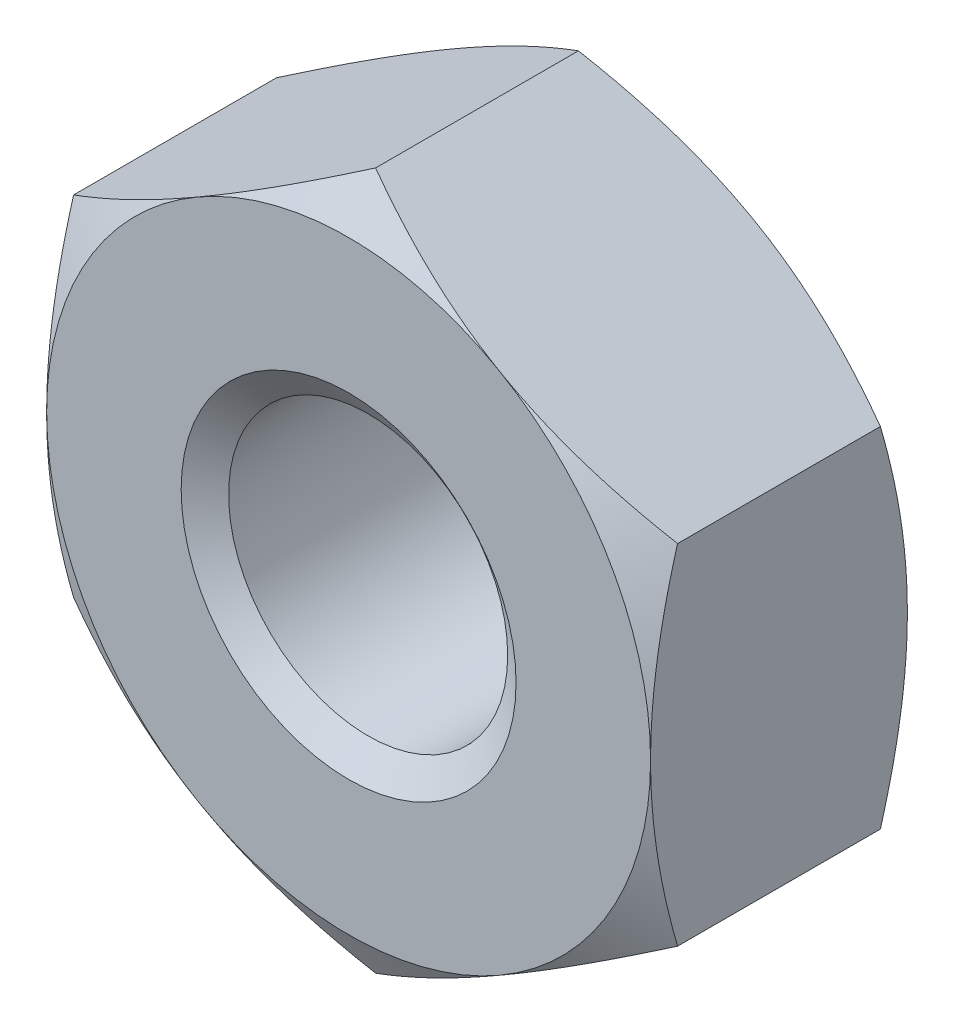
ISO-10303-21;
HEADER;
FILE_DESCRIPTION(('STEP AP214'),'2;1');
FILE_NAME('part.step','',(''),(''),'','','');
FILE_SCHEMA(('AUTOMOTIVE_DESIGN { 1 0 10303 214 1 1 1 1 }'));
ENDSEC;
DATA;
#1=APPLICATION_CONTEXT('core data for automotive mechanical design processes');
#2=APPLICATION_PROTOCOL_DEFINITION('international standard','automotive_design',2000,#1);
#3=PRODUCT_CONTEXT('',#1,'mechanical');
#4=PRODUCT('Part','Part','',(#3));
#5=PRODUCT_RELATED_PRODUCT_CATEGORY('part','',(#4));
#6=PRODUCT_DEFINITION_FORMATION('','',#4);
#7=PRODUCT_DEFINITION_CONTEXT('part definition',#1,'design');
#8=PRODUCT_DEFINITION('design','',#6,#7);
#9=PRODUCT_DEFINITION_SHAPE('','',#8);
#10=(LENGTH_UNIT() NAMED_UNIT(*) SI_UNIT(.MILLI.,.METRE.));
#11=(NAMED_UNIT(*) PLANE_ANGLE_UNIT() SI_UNIT($,.RADIAN.));
#12=(NAMED_UNIT(*) SI_UNIT($,.STERADIAN.) SOLID_ANGLE_UNIT());
#13=UNCERTAINTY_MEASURE_WITH_UNIT(LENGTH_MEASURE(1.E-05),#10,'distance_accuracy_value','');
#14=(GEOMETRIC_REPRESENTATION_CONTEXT(3) GLOBAL_UNCERTAINTY_ASSIGNED_CONTEXT((#13)) GLOBAL_UNIT_ASSIGNED_CONTEXT((#10,
#11,#12)) REPRESENTATION_CONTEXT('',''));
#15=CARTESIAN_POINT('',(0.,0.,0.));
#16=DIRECTION('',(0.,0.,1.));
#17=DIRECTION('',(1.,0.,0.));
#18=AXIS2_PLACEMENT_3D('',#15,#16,#17);
#19=CARTESIAN_POINT('',(0.,0.,-2.3));
#20=DIRECTION('',(0.,0.,1.));
#21=DIRECTION('',(1.,0.,0.));
#22=AXIS2_PLACEMENT_3D('',#19,#20,#21);
#23=CYLINDRICAL_SURFACE('',#22,1.25);
#24=CARTESIAN_POINT('',(0.,0.,-0.175051884552426));
#25=DIRECTION('',(0.,0.,1.));
#26=DIRECTION('',(1.,0.,0.));
#27=AXIS2_PLACEMENT_3D('',#24,#25,#26);
#28=CIRCLE('',#27,1.25);
#29=CARTESIAN_POINT('',(1.25,0.,-0.175051884552426));
#30=VERTEX_POINT('',#29);
#31=EDGE_CURVE('E175',#30,#30,#28,.F.);
#32=ORIENTED_EDGE('',*,*,#31,.F.);
#33=EDGE_LOOP('',(#32));
#34=FACE_BOUND('',#33,.T.);
#35=CARTESIAN_POINT('',(0.,0.,-2.09954811544757));
#36=DIRECTION('',(0.,0.,-1.));
#37=DIRECTION('',(-1.,0.,0.));
#38=AXIS2_PLACEMENT_3D('',#35,#36,#37);
#39=CIRCLE('',#38,1.25);
#40=CARTESIAN_POINT('',(-1.25,0.,-2.09954811544757));
#41=VERTEX_POINT('',#40);
#42=EDGE_CURVE('E39',#41,#41,#39,.F.);
#43=ORIENTED_EDGE('',*,*,#42,.F.);
#44=EDGE_LOOP('',(#43));
#45=FACE_BOUND('',#44,.T.);
#46=ADVANCED_FACE('F34',(#34,#45),#23,.F.);
#47=CARTESIAN_POINT('',(-5.40999999999999,0.,-2.3));
#48=DIRECTION('',(0.,0.,1.));
#49=DIRECTION('',(1.,0.,0.));
#50=AXIS2_PLACEMENT_3D('',#47,#48,#49);
#51=PLANE('',#50);
#52=CARTESIAN_POINT('',(0.,0.,-2.3));
#53=DIRECTION('',(0.,0.,1.));
#54=DIRECTION('',(1.,0.,0.));
#55=AXIS2_PLACEMENT_3D('',#52,#53,#54);
#56=CIRCLE('',#55,2.705);
#57=CARTESIAN_POINT('',(2.705,0.,-2.3));
#58=VERTEX_POINT('',#57);
#59=CARTESIAN_POINT('',(1.3525,2.34259871723691,-2.3));
#60=VERTEX_POINT('',#59);
#61=EDGE_CURVE('E245',#58,#60,#56,.T.);
#62=ORIENTED_EDGE('',*,*,#61,.F.);
#63=CARTESIAN_POINT('',(0.,0.,-2.3));
#64=DIRECTION('',(0.,0.,1.));
#65=DIRECTION('',(1.,0.,0.));
#66=AXIS2_PLACEMENT_3D('',#63,#64,#65);
#67=CIRCLE('',#66,2.705);
#68=CARTESIAN_POINT('',(1.3525,-2.34259871723691,-2.3));
#69=VERTEX_POINT('',#68);
#70=EDGE_CURVE('E169',#58,#69,#67,.F.);
#71=ORIENTED_EDGE('',*,*,#70,.T.);
#72=CARTESIAN_POINT('',(-1.3525,-2.34259871723691,-2.3));
#73=VERTEX_POINT('',#72);
#74=EDGE_CURVE('E171',#69,#73,#67,.F.);
#75=ORIENTED_EDGE('',*,*,#74,.T.);
#76=CARTESIAN_POINT('',(-2.705,0.,-2.3));
#77=VERTEX_POINT('',#76);
#78=EDGE_CURVE('E402',#73,#77,#67,.F.);
#79=ORIENTED_EDGE('',*,*,#78,.T.);
#80=CARTESIAN_POINT('',(-1.3525,2.34259871723691,-2.3));
#81=VERTEX_POINT('',#80);
#82=EDGE_CURVE('E404',#77,#81,#67,.F.);
#83=ORIENTED_EDGE('',*,*,#82,.T.);
#84=EDGE_CURVE('E153',#81,#60,#67,.F.);
#85=ORIENTED_EDGE('',*,*,#84,.T.);
#86=EDGE_LOOP('',(#62,#71,#75,#79,#83,#85));
#87=FACE_BOUND('',#86,.T.);
#88=CARTESIAN_POINT('',(0.,0.,-2.3));
#89=DIRECTION('',(0.,0.,1.));
#90=DIRECTION('',(1.,0.,0.));
#91=AXIS2_PLACEMENT_3D('',#88,#89,#90);
#92=CIRCLE('',#91,1.5);
#93=CARTESIAN_POINT('',(1.5,0.,-2.3));
#94=VERTEX_POINT('',#93);
#95=EDGE_CURVE('E178',#94,#94,#92,.F.);
#96=ORIENTED_EDGE('',*,*,#95,.F.);
#97=EDGE_LOOP('',(#96));
#98=FACE_BOUND('',#97,.T.);
#99=ADVANCED_FACE('F297',(#87,#98),#51,.F.);
#100=CARTESIAN_POINT('',(-5.40999999999999,0.,0.));
#101=DIRECTION('',(0.,0.,1.));
#102=DIRECTION('',(1.,0.,0.));
#103=AXIS2_PLACEMENT_3D('',#100,#101,#102);
#104=PLANE('',#103);
#105=CARTESIAN_POINT('',(0.,0.,0.));
#106=DIRECTION('',(0.,0.,1.));
#107=DIRECTION('',(1.,0.,0.));
#108=AXIS2_PLACEMENT_3D('',#105,#106,#107);
#109=CIRCLE('',#108,2.705);
#110=CARTESIAN_POINT('',(1.3525,-2.34259871723691,0.));
#111=VERTEX_POINT('',#110);
#112=CARTESIAN_POINT('',(2.705,0.,0.));
#113=VERTEX_POINT('',#112);
#114=EDGE_CURVE('E46',#111,#113,#109,.T.);
#115=ORIENTED_EDGE('',*,*,#114,.T.);
#116=CARTESIAN_POINT('',(0.,0.,0.));
#117=DIRECTION('',(0.,0.,1.));
#118=DIRECTION('',(1.,0.,0.));
#119=AXIS2_PLACEMENT_3D('',#116,#117,#118);
#120=CIRCLE('',#119,2.705);
#121=CARTESIAN_POINT('',(1.3525,2.34259871723691,0.));
#122=VERTEX_POINT('',#121);
#123=EDGE_CURVE('E53',#113,#122,#120,.T.);
#124=ORIENTED_EDGE('',*,*,#123,.T.);
#125=CARTESIAN_POINT('',(-1.3525,2.34259871723691,0.));
#126=VERTEX_POINT('',#125);
#127=EDGE_CURVE('E11',#122,#126,#109,.T.);
#128=ORIENTED_EDGE('',*,*,#127,.T.);
#129=CARTESIAN_POINT('',(-2.705,0.,0.));
#130=VERTEX_POINT('',#129);
#131=EDGE_CURVE('E44',#126,#130,#109,.T.);
#132=ORIENTED_EDGE('',*,*,#131,.T.);
#133=CARTESIAN_POINT('',(-1.3525,-2.34259871723691,0.));
#134=VERTEX_POINT('',#133);
#135=EDGE_CURVE('E348',#130,#134,#109,.T.);
#136=ORIENTED_EDGE('',*,*,#135,.T.);
#137=EDGE_CURVE('E174',#134,#111,#109,.T.);
#138=ORIENTED_EDGE('',*,*,#137,.T.);
#139=EDGE_LOOP('',(#115,#124,#128,#132,#136,#138));
#140=FACE_BOUND('',#139,.T.);
#141=CARTESIAN_POINT('',(0.,0.,0.));
#142=DIRECTION('',(0.,0.,1.));
#143=DIRECTION('',(1.,0.,0.));
#144=AXIS2_PLACEMENT_3D('',#141,#142,#143);
#145=CIRCLE('',#144,1.5);
#146=CARTESIAN_POINT('',(1.5,0.,0.));
#147=VERTEX_POINT('',#146);
#148=EDGE_CURVE('E177',#147,#147,#145,.T.);
#149=ORIENTED_EDGE('',*,*,#148,.F.);
#150=EDGE_LOOP('',(#149));
#151=FACE_BOUND('',#150,.T.);
#152=ADVANCED_FACE('F250',(#140,#151),#104,.T.);
#153=CARTESIAN_POINT('',(0.,3.12346495631588,-2.3));
#154=DIRECTION('',(-0.500000000000001,0.866025403784438,0.));
#155=DIRECTION('',(-0.866025403784438,-0.500000000000001,0.));
#156=AXIS2_PLACEMENT_3D('',#153,#154,#155);
#157=PLANE('',#156);
#158=DIRECTION('',(0.,0.,1.));
#159=VECTOR('',#158,1.);
#160=CARTESIAN_POINT('',(-2.705,1.56173247815794,-2.3));
#161=LINE('',#160,#159);
#162=CARTESIAN_POINT('',(-2.705,1.56173247815794,-2.0583991448246));
#163=VERTEX_POINT('',#162);
#164=CARTESIAN_POINT('',(-2.705,1.56173247815794,-0.241600855175396));
#165=VERTEX_POINT('',#164);
#166=EDGE_CURVE('E165',#163,#165,#161,.T.);
#167=ORIENTED_EDGE('',*,*,#166,.T.);
#168=CARTESIAN_POINT('',(-2.7052,1.5616170081041,-0.241667525538783));
#169=CARTESIAN_POINT('',(-2.58632825680688,1.63024764103569,-0.202027774658742));
#170=CARTESIAN_POINT('',(-2.4664304218686,1.69947068831256,-0.165976659538689));
#171=CARTESIAN_POINT('',(-2.22455852606025,1.83911549246691,-0.103048601430435));
#172=CARTESIAN_POINT('',(-2.10258016695556,1.90953973093131,-0.0761939208944315));
#173=CARTESIAN_POINT('',(-1.8601351667638,2.0495154170557,-0.0343900483953198));
#174=CARTESIAN_POINT('',(-1.73970583224199,2.1190453257602,-0.0191626405786178));
#175=CARTESIAN_POINT('',(-1.49828040231533,2.25843236271758,-0.000983153261820243));
#176=CARTESIAN_POINT('',(-1.37728518462876,2.32828898421958,0.00198397922888698));
#177=CARTESIAN_POINT('',(-1.15119223938198,2.45882380701968,-0.00418341604988198));
#178=CARTESIAN_POINT('',(-1.04606069401314,2.5195215330387,-0.0118036374939056));
#179=CARTESIAN_POINT('',(-0.836482545838846,2.64052153330339,-0.0359569039149928));
#180=CARTESIAN_POINT('',(-0.732036668110246,2.70082338892575,-0.052498202432647));
#181=CARTESIAN_POINT('',(-0.522026288785161,2.8220729379617,-0.0938508132152027));
#182=CARTESIAN_POINT('',(-0.416488372042922,2.88300528260255,-0.118837445864966));
#183=CARTESIAN_POINT('',(-0.206986757533964,3.00396109613495,-0.175547523369917));
#184=CARTESIAN_POINT('',(-0.103020375018959,3.06398611506666,-0.207257640313646));
#185=CARTESIAN_POINT('',(0.000200000000000147,3.12358042636972,-0.241667525538785));
#186=B_SPLINE_CURVE_WITH_KNOTS('',3,(#168,#169,#170,#171,#172,#173,#174,#175,#176,#177,#178,
#179,#180,#181,#182,#183,#184,#185),.UNSPECIFIED.,.F.,.F.,(4,2,2,2,2,2,2,2,4),(0.,
0.428779968479325,0.858590696260524,1.27776339794879,1.69642129218898,2.06097746545958,
2.42587149633085,2.7988602815117,3.17111649317388),.UNSPECIFIED.);
#187=EDGE_CURVE('E61',#165,#126,#186,.T.);
#188=ORIENTED_EDGE('',*,*,#187,.T.);
#189=CARTESIAN_POINT('',(0.,3.12346495631588,-0.241600855175397));
#190=VERTEX_POINT('',#189);
#191=EDGE_CURVE('E239',#126,#190,#186,.T.);
#192=ORIENTED_EDGE('',*,*,#191,.T.);
#193=DIRECTION('',(0.,0.,1.));
#194=VECTOR('',#193,1.);
#195=CARTESIAN_POINT('',(0.,3.12346495631588,-2.3));
#196=LINE('',#195,#194);
#197=CARTESIAN_POINT('',(0.,3.12346495631588,-2.0583991448246));
#198=VERTEX_POINT('',#197);
#199=EDGE_CURVE('E150',#198,#190,#196,.T.);
#200=ORIENTED_EDGE('',*,*,#199,.F.);
#201=CARTESIAN_POINT('',(-2.7052,1.5616170081041,-2.05833247446122));
#202=CARTESIAN_POINT('',(-2.58632825680688,1.63024764103569,-2.09797222534126));
#203=CARTESIAN_POINT('',(-2.4664304218686,1.69947068831256,-2.13402334046131));
#204=CARTESIAN_POINT('',(-2.22455852606025,1.83911549246691,-2.19695139856957));
#205=CARTESIAN_POINT('',(-2.10258016695556,1.90953973093131,-2.22380607910557));
#206=CARTESIAN_POINT('',(-1.8601351667638,2.0495154170557,-2.26560995160468));
#207=CARTESIAN_POINT('',(-1.73970583224199,2.1190453257602,-2.28083735942138));
#208=CARTESIAN_POINT('',(-1.49828040231533,2.25843236271758,-2.29901684673818));
#209=CARTESIAN_POINT('',(-1.37728518462876,2.32828898421958,-2.30198397922889));
#210=CARTESIAN_POINT('',(-1.15119223938198,2.45882380701968,-2.29581658395012));
#211=CARTESIAN_POINT('',(-1.04606069401314,2.5195215330387,-2.28819636250609));
#212=CARTESIAN_POINT('',(-0.836482545838846,2.64052153330339,-2.26404309608501));
#213=CARTESIAN_POINT('',(-0.732036668110246,2.70082338892575,-2.24750179756735));
#214=CARTESIAN_POINT('',(-0.522026288785161,2.8220729379617,-2.2061491867848));
#215=CARTESIAN_POINT('',(-0.416488372042922,2.88300528260255,-2.18116255413503));
#216=CARTESIAN_POINT('',(-0.206986757533964,3.00396109613495,-2.12445247663008));
#217=CARTESIAN_POINT('',(-0.103020375018959,3.06398611506666,-2.09274235968635));
#218=CARTESIAN_POINT('',(0.000200000000000144,3.12358042636972,-2.05833247446122));
#219=B_SPLINE_CURVE_WITH_KNOTS('',3,(#201,#202,#203,#204,#205,#206,#207,#208,#209,#210,#211,
#212,#213,#214,#215,#216,#217,#218),.UNSPECIFIED.,.F.,.F.,(4,2,2,2,2,2,2,2,4),(0.,
0.428779968479325,0.858590696260524,1.27776339794879,1.69642129218898,2.06097746545958,
2.42587149633085,2.7988602815117,3.17111649317388),.UNSPECIFIED.);
#220=EDGE_CURVE('E168',#81,#198,#219,.T.);
#221=ORIENTED_EDGE('',*,*,#220,.F.);
#222=EDGE_CURVE('E260',#163,#81,#219,.T.);
#223=ORIENTED_EDGE('',*,*,#222,.F.);
#224=EDGE_LOOP('',(#167,#188,#192,#200,#221,#223));
#225=FACE_BOUND('',#224,.T.);
#226=ADVANCED_FACE('F36',(#225),#157,.T.);
#227=CARTESIAN_POINT('',(2.705,1.56173247815794,-2.3));
#228=DIRECTION('',(0.500000000000001,0.866025403784438,0.));
#229=DIRECTION('',(-0.866025403784438,0.500000000000001,0.));
#230=AXIS2_PLACEMENT_3D('',#227,#228,#229);
#231=PLANE('',#230);
#232=ORIENTED_EDGE('',*,*,#199,.T.);
#233=CARTESIAN_POINT('',(-0.000199999999999892,3.12358042636971,-0.241667525538785));
#234=CARTESIAN_POINT('',(0.118671743193122,3.05494979343813,-0.202027774658744));
#235=CARTESIAN_POINT('',(0.238569578131402,2.98572674616126,-0.16597665953869));
#236=CARTESIAN_POINT('',(0.480441473939753,2.8460819420069,-0.103048601430436));
#237=CARTESIAN_POINT('',(0.602419833044443,2.7756577035425,-0.0761939208944324));
#238=CARTESIAN_POINT('',(0.844864833236197,2.63568201741811,-0.0343900483953204));
#239=CARTESIAN_POINT('',(0.96529416775801,2.56615210871361,-0.0191626405786181));
#240=CARTESIAN_POINT('',(1.20671959768467,2.42676507175624,-0.000983153261820372));
#241=CARTESIAN_POINT('',(1.32771481537124,2.35690845025424,0.00198397922888688));
#242=CARTESIAN_POINT('',(1.55380776061802,2.22637362745413,-0.00418341604988177));
#243=CARTESIAN_POINT('',(1.65893930598686,2.16567590143511,-0.0118036374939051));
#244=CARTESIAN_POINT('',(1.86851745416115,2.04467590117042,-0.035956903914992));
#245=CARTESIAN_POINT('',(1.97296333188975,1.98437404554806,-0.0524982024326461));
#246=CARTESIAN_POINT('',(2.18297371121484,1.86312449651211,-0.0938508132152015));
#247=CARTESIAN_POINT('',(2.28851162795708,1.80219215187127,-0.118837445864964));
#248=CARTESIAN_POINT('',(2.49801324246604,1.68123633833886,-0.175547523369916));
#249=CARTESIAN_POINT('',(2.60197962498104,1.62121131940715,-0.207257640313644));
#250=CARTESIAN_POINT('',(2.7052,1.5616170081041,-0.241667525538783));
#251=B_SPLINE_CURVE_WITH_KNOTS('',3,(#233,#234,#235,#236,#237,#238,#239,#240,#241,#242,#243,
#244,#245,#246,#247,#248,#249,#250),.UNSPECIFIED.,.F.,.F.,(4,2,2,2,2,2,2,2,4),(0.,
0.428779968479326,0.858590696260524,1.27776339794879,1.69642129218898,2.06097746545958,
2.42587149633085,2.7988602815117,3.17111649317388),.UNSPECIFIED.);
#252=EDGE_CURVE('E143',#190,#122,#251,.T.);
#253=ORIENTED_EDGE('',*,*,#252,.T.);
#254=CARTESIAN_POINT('',(2.705,1.56173247815794,-0.241600855175397));
#255=VERTEX_POINT('',#254);
#256=EDGE_CURVE('E129',#122,#255,#251,.T.);
#257=ORIENTED_EDGE('',*,*,#256,.T.);
#258=DIRECTION('',(0.,0.,1.));
#259=VECTOR('',#258,1.);
#260=CARTESIAN_POINT('',(2.705,1.56173247815794,-2.3));
#261=LINE('',#260,#259);
#262=CARTESIAN_POINT('',(2.705,1.56173247815794,-2.0583991448246));
#263=VERTEX_POINT('',#262);
#264=EDGE_CURVE('E142',#263,#255,#261,.T.);
#265=ORIENTED_EDGE('',*,*,#264,.F.);
#266=CARTESIAN_POINT('',(-0.000199999999999892,3.12358042636971,-2.05833247446122));
#267=CARTESIAN_POINT('',(0.118671743193123,3.05494979343813,-2.09797222534126));
#268=CARTESIAN_POINT('',(0.238569578131402,2.98572674616126,-2.13402334046131));
#269=CARTESIAN_POINT('',(0.480441473939753,2.8460819420069,-2.19695139856956));
#270=CARTESIAN_POINT('',(0.602419833044442,2.7756577035425,-2.22380607910557));
#271=CARTESIAN_POINT('',(0.844864833236197,2.63568201741811,-2.26560995160468));
#272=CARTESIAN_POINT('',(0.96529416775801,2.56615210871361,-2.28083735942138));
#273=CARTESIAN_POINT('',(1.20671959768467,2.42676507175624,-2.29901684673818));
#274=CARTESIAN_POINT('',(1.32771481537124,2.35690845025424,-2.30198397922889));
#275=CARTESIAN_POINT('',(1.55380776061802,2.22637362745413,-2.29581658395012));
#276=CARTESIAN_POINT('',(1.65893930598686,2.16567590143511,-2.28819636250609));
#277=CARTESIAN_POINT('',(1.86851745416115,2.04467590117042,-2.26404309608501));
#278=CARTESIAN_POINT('',(1.97296333188975,1.98437404554806,-2.24750179756735));
#279=CARTESIAN_POINT('',(2.18297371121484,1.86312449651211,-2.2061491867848));
#280=CARTESIAN_POINT('',(2.28851162795708,1.80219215187127,-2.18116255413504));
#281=CARTESIAN_POINT('',(2.49801324246604,1.68123633833886,-2.12445247663008));
#282=CARTESIAN_POINT('',(2.60197962498104,1.62121131940715,-2.09274235968636));
#283=CARTESIAN_POINT('',(2.7052,1.5616170081041,-2.05833247446122));
#284=B_SPLINE_CURVE_WITH_KNOTS('',3,(#266,#267,#268,#269,#270,#271,#272,#273,#274,#275,#276,
#277,#278,#279,#280,#281,#282,#283),.UNSPECIFIED.,.F.,.F.,(4,2,2,2,2,2,2,2,4),(0.,
0.428779968479325,0.858590696260524,1.27776339794879,1.69642129218898,2.06097746545958,
2.42587149633085,2.7988602815117,3.17111649317388),.UNSPECIFIED.);
#285=EDGE_CURVE('E254',#60,#263,#284,.T.);
#286=ORIENTED_EDGE('',*,*,#285,.F.);
#287=EDGE_CURVE('E259',#198,#60,#284,.T.);
#288=ORIENTED_EDGE('',*,*,#287,.F.);
#289=EDGE_LOOP('',(#232,#253,#257,#265,#286,#288));
#290=FACE_BOUND('',#289,.T.);
#291=ADVANCED_FACE('F140',(#290),#231,.T.);
#292=CARTESIAN_POINT('',(2.705,1.56173247815794,-2.3));
#293=DIRECTION('',(-1.,0.,0.));
#294=DIRECTION('',(0.,0.,1.));
#295=AXIS2_PLACEMENT_3D('',#292,#293,#294);
#296=PLANE('',#295);
#297=CARTESIAN_POINT('',(2.705,-4.14194468320972,-1.29441473786399));
#298=CARTESIAN_POINT('',(2.705,-4.02317988672405,-1.23702102810612));
#299=CARTESIAN_POINT('',(2.705,-3.90413429104437,-1.18019785932476));
#300=CARTESIAN_POINT('',(2.705,-3.66532967331092,-1.06801863052158));
#301=CARTESIAN_POINT('',(2.705,-3.54557053207426,-1.01266282451334));
#302=CARTESIAN_POINT('',(2.705,-3.30454006602883,-0.903452730643352));
#303=CARTESIAN_POINT('',(2.705,-3.18326400948931,-0.849608848161381));
#304=CARTESIAN_POINT('',(2.705,-2.93971511372837,-0.744233808390478));
#305=CARTESIAN_POINT('',(2.705,-2.81744232685817,-0.6927025305498));
#306=CARTESIAN_POINT('',(2.705,-2.57018757936291,-0.591955877329189));
#307=CARTESIAN_POINT('',(2.705,-2.44519078771398,-0.542776700950967));
#308=CARTESIAN_POINT('',(2.705,-2.19372285645097,-0.448270051186309));
#309=CARTESIAN_POINT('',(2.705,-2.06725155458036,-0.402943006329349));
#310=CARTESIAN_POINT('',(2.705,-1.81289315219112,-0.317358544876384));
#311=CARTESIAN_POINT('',(2.705,-1.68500971560814,-0.277090350272571));
#312=CARTESIAN_POINT('',(2.705,-1.42742481197494,-0.202931369863223));
#313=CARTESIAN_POINT('',(2.705,-1.29772393384363,-0.169038567293904));
#314=CARTESIAN_POINT('',(2.705,-1.03641556112158,-0.109275775087671));
#315=CARTESIAN_POINT('',(2.705,-0.904807568614032,-0.0834079216281105));
#316=CARTESIAN_POINT('',(2.705,-0.640004843371316,-0.0414367020424847));
#317=CARTESIAN_POINT('',(2.705,-0.506810109233373,-0.0253333445494614));
#318=CARTESIAN_POINT('',(2.705,-0.240374407985897,-0.00431570114230613));
#319=CARTESIAN_POINT('',(2.705,-0.107139174127326,0.000669420389654479));
#320=CARTESIAN_POINT('',(2.705,0.15923799789205,-0.00081424988595532));
#321=CARTESIAN_POINT('',(2.705,0.292379951293628,-0.00728006848888086));
#322=CARTESIAN_POINT('',(2.705,0.519739129571255,-0.0276442442824407));
#323=CARTESIAN_POINT('',(2.705,0.614207185680704,-0.038890661449694));
#324=CARTESIAN_POINT('',(2.705,0.802413560541899,-0.0664168187469503));
#325=CARTESIAN_POINT('',(2.705,0.896151761814351,-0.0826973526857744));
#326=CARTESIAN_POINT('',(2.705,1.1761951698757,-0.138235691730094));
#327=CARTESIAN_POINT('',(2.705,1.36118771970048,-0.18417593444501));
#328=CARTESIAN_POINT('',(2.705,1.63800093601071,-0.263410437988259));
#329=CARTESIAN_POINT('',(2.705,1.7312644896449,-0.291946553150119));
#330=CARTESIAN_POINT('',(2.705,1.91681817592324,-0.351842447379024));
#331=CARTESIAN_POINT('',(2.705,2.0091089315918,-0.3832002788714));
#332=CARTESIAN_POINT('',(2.705,2.19233109149175,-0.448087104070669));
#333=CARTESIAN_POINT('',(2.705,2.28326722311549,-0.481602883540805));
#334=CARTESIAN_POINT('',(2.705,2.46443394354658,-0.550601636750962));
#335=CARTESIAN_POINT('',(2.705,2.55466423014385,-0.586085405563978));
#336=CARTESIAN_POINT('',(2.705,2.64456826439745,-0.622358965673887));
#337=B_SPLINE_CURVE_WITH_KNOTS('',3,(#297,#298,#299,#300,#301,#302,#303,#304,#305,#306,#307,
#308,#309,#310,#311,#312,#313,#314,#315,#316,#317,#318,#319,#320,#321,#322,#323,#324,#325,#326,
#327,#328,#329,#330,#331,#332,#333,#334,#335,#336),.UNSPECIFIED.,.F.,.F.,(4,2,2,2,2,2,2,2,2,2,2,
2,2,2,2,2,2,2,2,4),(0.,0.395722424699949,0.791512910942756,1.18956834629351,1.58760300760114,
1.99052429924548,2.39349035526229,2.79558277251753,3.19754777890982,3.5996196935463,
4.00169196366437,4.40119517558793,4.80059467282499,5.08586080233259,5.37117193722231,
5.94221883532085,6.23479021883313,6.52716119349896,6.81788650789334,7.10873014401107),.UNSPECIFIED.);
#338=CARTESIAN_POINT('',(2.705,-1.56173247815794,-0.241600855175397));
#339=VERTEX_POINT('',#338);
#340=EDGE_CURVE('E135',#339,#113,#337,.T.);
#341=ORIENTED_EDGE('',*,*,#340,.F.);
#342=DIRECTION('',(0.,0.,1.));
#343=VECTOR('',#342,1.);
#344=CARTESIAN_POINT('',(2.705,-1.56173247815794,-2.3));
#345=LINE('',#344,#343);
#346=CARTESIAN_POINT('',(2.705,-1.56173247815794,-2.0583991448246));
#347=VERTEX_POINT('',#346);
#348=EDGE_CURVE('E151',#347,#339,#345,.T.);
#349=ORIENTED_EDGE('',*,*,#348,.F.);
#350=CARTESIAN_POINT('',(2.705,-4.14194468320972,-1.00558526213601));
#351=CARTESIAN_POINT('',(2.705,-4.02317988672405,-1.06297897189388));
#352=CARTESIAN_POINT('',(2.705,-3.90413429104437,-1.11980214067524));
#353=CARTESIAN_POINT('',(2.705,-3.66532967331092,-1.23198136947841));
#354=CARTESIAN_POINT('',(2.705,-3.54557053207426,-1.28733717548666));
#355=CARTESIAN_POINT('',(2.705,-3.30454006602883,-1.39654726935665));
#356=CARTESIAN_POINT('',(2.705,-3.18326400948931,-1.45039115183862));
#357=CARTESIAN_POINT('',(2.705,-2.93971511372837,-1.55576619160952));
#358=CARTESIAN_POINT('',(2.705,-2.81744232685817,-1.6072974694502));
#359=CARTESIAN_POINT('',(2.705,-2.57018757936291,-1.70804412267081));
#360=CARTESIAN_POINT('',(2.705,-2.44519078771398,-1.75722329904903));
#361=CARTESIAN_POINT('',(2.705,-2.19372285645098,-1.85172994881369));
#362=CARTESIAN_POINT('',(2.705,-2.06725155458036,-1.89705699367065));
#363=CARTESIAN_POINT('',(2.705,-1.81289315219112,-1.98264145512362));
#364=CARTESIAN_POINT('',(2.705,-1.68500971560814,-2.02290964972743));
#365=CARTESIAN_POINT('',(2.705,-1.42742481197494,-2.09706863013678));
#366=CARTESIAN_POINT('',(2.705,-1.29772393384363,-2.1309614327061));
#367=CARTESIAN_POINT('',(2.705,-1.03641556112158,-2.19072422491233));
#368=CARTESIAN_POINT('',(2.705,-0.904807568614032,-2.21659207837189));
#369=CARTESIAN_POINT('',(2.705,-0.640004843371315,-2.25856329795751));
#370=CARTESIAN_POINT('',(2.705,-0.506810109233373,-2.27466665545054));
#371=CARTESIAN_POINT('',(2.705,-0.240374407985897,-2.29568429885769));
#372=CARTESIAN_POINT('',(2.705,-0.107139174127326,-2.30066942038965));
#373=CARTESIAN_POINT('',(2.705,0.15923799789205,-2.29918575011404));
#374=CARTESIAN_POINT('',(2.705,0.292379951293628,-2.29271993151112));
#375=CARTESIAN_POINT('',(2.705,0.519739129571255,-2.27235575571756));
#376=CARTESIAN_POINT('',(2.705,0.614207185680704,-2.26110933855031));
#377=CARTESIAN_POINT('',(2.705,0.802413560541899,-2.23358318125305));
#378=CARTESIAN_POINT('',(2.705,0.89615176181435,-2.21730264731423));
#379=CARTESIAN_POINT('',(2.705,1.1761951698757,-2.16176430826991));
#380=CARTESIAN_POINT('',(2.705,1.36118771970048,-2.11582406555499));
#381=CARTESIAN_POINT('',(2.705,1.63800093601071,-2.03658956201174));
#382=CARTESIAN_POINT('',(2.705,1.7312644896449,-2.00805344684988));
#383=CARTESIAN_POINT('',(2.705,1.91681817592324,-1.94815755262098));
#384=CARTESIAN_POINT('',(2.705,2.0091089315918,-1.9167997211286));
#385=CARTESIAN_POINT('',(2.705,2.19233109149175,-1.85191289592933));
#386=CARTESIAN_POINT('',(2.705,2.28326722311549,-1.8183971164592));
#387=CARTESIAN_POINT('',(2.705,2.46443394354658,-1.74939836324904));
#388=CARTESIAN_POINT('',(2.705,2.55466423014385,-1.71391459443602));
#389=CARTESIAN_POINT('',(2.705,2.64456826439745,-1.67764103432611));
#390=B_SPLINE_CURVE_WITH_KNOTS('',3,(#350,#351,#352,#353,#354,#355,#356,#357,#358,#359,#360,
#361,#362,#363,#364,#365,#366,#367,#368,#369,#370,#371,#372,#373,#374,#375,#376,#377,#378,#379,
#380,#381,#382,#383,#384,#385,#386,#387,#388,#389),.UNSPECIFIED.,.F.,.F.,(4,2,2,2,2,2,2,2,2,2,2,
2,2,2,2,2,2,2,2,4),(0.,0.395722424699949,0.791512910942756,1.18956834629351,1.58760300760114,
1.99052429924548,2.39349035526229,2.79558277251753,3.19754777890983,3.59961969354631,
4.00169196366438,4.40119517558793,4.80059467282499,5.08586080233259,5.37117193722231,
5.94221883532085,6.23479021883312,6.52716119349896,6.81788650789334,7.10873014401107),.UNSPECIFIED.);
#391=EDGE_CURVE('E265',#347,#58,#390,.T.);
#392=ORIENTED_EDGE('',*,*,#391,.T.);
#393=EDGE_CURVE('E149',#58,#263,#390,.T.);
#394=ORIENTED_EDGE('',*,*,#393,.T.);
#395=ORIENTED_EDGE('',*,*,#264,.T.);
#396=EDGE_CURVE('E126',#113,#255,#337,.T.);
#397=ORIENTED_EDGE('',*,*,#396,.F.);
#398=EDGE_LOOP('',(#341,#349,#392,#394,#395,#397));
#399=FACE_BOUND('',#398,.T.);
#400=ADVANCED_FACE('F146',(#399),#296,.F.);
#401=CARTESIAN_POINT('',(0.,-3.12346495631588,-2.3));
#402=DIRECTION('',(0.500000000000001,-0.866025403784438,0.));
#403=DIRECTION('',(0.866025403784438,0.500000000000001,0.));
#404=AXIS2_PLACEMENT_3D('',#401,#402,#403);
#405=PLANE('',#404);
#406=ORIENTED_EDGE('',*,*,#348,.T.);
#407=CARTESIAN_POINT('',(2.7052,-1.5616170081041,-0.241667525538786));
#408=CARTESIAN_POINT('',(2.58632825680688,-1.63024764103569,-0.202027774658745));
#409=CARTESIAN_POINT('',(2.4664304218686,-1.69947068831256,-0.165976659538691));
#410=CARTESIAN_POINT('',(2.22455852606025,-1.83911549246692,-0.103048601430437));
#411=CARTESIAN_POINT('',(2.10258016695556,-1.90953973093132,-0.0761939208944339));
#412=CARTESIAN_POINT('',(1.8601351667638,-2.04951541705571,-0.0343900483953227));
#413=CARTESIAN_POINT('',(1.73970583224199,-2.11904532576021,-0.0191626405786209));
#414=CARTESIAN_POINT('',(1.49828040231533,-2.25843236271758,-0.000983153261823709));
#415=CARTESIAN_POINT('',(1.37728518462876,-2.32828898421958,0.00198397922888349));
#416=CARTESIAN_POINT('',(1.15119223938198,-2.45882380701969,-0.00418341604988584));
#417=CARTESIAN_POINT('',(1.04606069401314,-2.51952153303871,-0.0118036374939098));
#418=CARTESIAN_POINT('',(0.836482545838844,-2.6405215333034,-0.0359569039149972));
#419=CARTESIAN_POINT('',(0.732036668110245,-2.70082338892576,-0.0524982024326513));
#420=CARTESIAN_POINT('',(0.52202628878516,-2.82207293796171,-0.093850813215207));
#421=CARTESIAN_POINT('',(0.416488372042922,-2.88300528260255,-0.11883744586497));
#422=CARTESIAN_POINT('',(0.206986757533964,-3.00396109613496,-0.175547523369922));
#423=CARTESIAN_POINT('',(0.103020375018958,-3.06398611506667,-0.20725764031365));
#424=CARTESIAN_POINT('',(-0.000199999999999974,-3.12358042636972,-0.241667525538789));
#425=B_SPLINE_CURVE_WITH_KNOTS('',3,(#407,#408,#409,#410,#411,#412,#413,#414,#415,#416,#417,
#418,#419,#420,#421,#422,#423,#424),.UNSPECIFIED.,.F.,.F.,(4,2,2,2,2,2,2,2,4),(0.,
0.428779968479326,0.858590696260525,1.27776339794879,1.69642129218898,2.06097746545958,
2.42587149633085,2.7988602815117,3.17111649317388),.UNSPECIFIED.);
#426=EDGE_CURVE('E336',#339,#111,#425,.T.);
#427=ORIENTED_EDGE('',*,*,#426,.T.);
#428=CARTESIAN_POINT('',(0.,-3.12346495631588,-0.241600855175397));
#429=VERTEX_POINT('',#428);
#430=EDGE_CURVE('E226',#111,#429,#425,.T.);
#431=ORIENTED_EDGE('',*,*,#430,.T.);
#432=DIRECTION('',(0.,0.,1.));
#433=VECTOR('',#432,1.);
#434=CARTESIAN_POINT('',(0.,-3.12346495631588,-2.3));
#435=LINE('',#434,#433);
#436=CARTESIAN_POINT('',(0.,-3.12346495631588,-2.0583991448246));
#437=VERTEX_POINT('',#436);
#438=EDGE_CURVE('E156',#437,#429,#435,.T.);
#439=ORIENTED_EDGE('',*,*,#438,.F.);
#440=CARTESIAN_POINT('',(2.7052,-1.5616170081041,-2.05833247446121));
#441=CARTESIAN_POINT('',(2.58632825680688,-1.63024764103569,-2.09797222534126));
#442=CARTESIAN_POINT('',(2.4664304218686,-1.69947068831256,-2.13402334046131));
#443=CARTESIAN_POINT('',(2.22455852606025,-1.83911549246692,-2.19695139856956));
#444=CARTESIAN_POINT('',(2.10258016695556,-1.90953973093132,-2.22380607910556));
#445=CARTESIAN_POINT('',(1.8601351667638,-2.04951541705571,-2.26560995160468));
#446=CARTESIAN_POINT('',(1.73970583224199,-2.11904532576021,-2.28083735942138));
#447=CARTESIAN_POINT('',(1.49828040231533,-2.25843236271758,-2.29901684673818));
#448=CARTESIAN_POINT('',(1.37728518462876,-2.32828898421958,-2.30198397922888));
#449=CARTESIAN_POINT('',(1.15119223938198,-2.45882380701969,-2.29581658395011));
#450=CARTESIAN_POINT('',(1.04606069401314,-2.51952153303871,-2.28819636250609));
#451=CARTESIAN_POINT('',(0.836482545838845,-2.6405215333034,-2.264043096085));
#452=CARTESIAN_POINT('',(0.732036668110245,-2.70082338892576,-2.24750179756735));
#453=CARTESIAN_POINT('',(0.52202628878516,-2.82207293796171,-2.20614918678479));
#454=CARTESIAN_POINT('',(0.416488372042922,-2.88300528260255,-2.18116255413503));
#455=CARTESIAN_POINT('',(0.206986757533964,-3.00396109613496,-2.12445247663008));
#456=CARTESIAN_POINT('',(0.103020375018959,-3.06398611506667,-2.09274235968635));
#457=CARTESIAN_POINT('',(-0.000199999999999717,-3.12358042636972,-2.05833247446121));
#458=B_SPLINE_CURVE_WITH_KNOTS('',3,(#440,#441,#442,#443,#444,#445,#446,#447,#448,#449,#450,
#451,#452,#453,#454,#455,#456,#457),.UNSPECIFIED.,.F.,.F.,(4,2,2,2,2,2,2,2,4),(0.,
0.428779968479326,0.858590696260524,1.27776339794879,1.69642129218898,2.06097746545958,
2.42587149633085,2.7988602815117,3.17111649317388),.UNSPECIFIED.);
#459=EDGE_CURVE('E271',#69,#437,#458,.T.);
#460=ORIENTED_EDGE('',*,*,#459,.F.);
#461=EDGE_CURVE('E270',#347,#69,#458,.T.);
#462=ORIENTED_EDGE('',*,*,#461,.F.);
#463=EDGE_LOOP('',(#406,#427,#431,#439,#460,#462));
#464=FACE_BOUND('',#463,.T.);
#465=ADVANCED_FACE('F281',(#464),#405,.T.);
#466=CARTESIAN_POINT('',(-2.705,-1.56173247815794,-2.3));
#467=DIRECTION('',(-0.500000000000001,-0.866025403784438,0.));
#468=DIRECTION('',(0.866025403784438,-0.500000000000001,0.));
#469=AXIS2_PLACEMENT_3D('',#466,#467,#468);
#470=PLANE('',#469);
#471=ORIENTED_EDGE('',*,*,#438,.T.);
#472=CARTESIAN_POINT('',(0.000199999999999939,-3.12358042636972,-0.241667525538789));
#473=CARTESIAN_POINT('',(-0.118671743193123,-3.05494979343813,-0.202027774658748));
#474=CARTESIAN_POINT('',(-0.238569578131403,-2.98572674616126,-0.165976659538694));
#475=CARTESIAN_POINT('',(-0.480441473939754,-2.84608194200691,-0.10304860143044));
#476=CARTESIAN_POINT('',(-0.602419833044444,-2.7756577035425,-0.0761939208944363));
#477=CARTESIAN_POINT('',(-0.844864833236199,-2.63568201741812,-0.0343900483953243));
#478=CARTESIAN_POINT('',(-0.965294167758012,-2.56615210871362,-0.0191626405786221));
#479=CARTESIAN_POINT('',(-1.20671959768467,-2.42676507175624,-0.000983153261824139));
#480=CARTESIAN_POINT('',(-1.32771481537124,-2.35690845025424,0.00198397922888339));
#481=CARTESIAN_POINT('',(-1.55380776061802,-2.22637362745414,-0.00418341604988528));
#482=CARTESIAN_POINT('',(-1.65893930598686,-2.16567590143512,-0.0118036374939088));
#483=CARTESIAN_POINT('',(-1.86851745416116,-2.04467590117042,-0.0359569039149957));
#484=CARTESIAN_POINT('',(-1.97296333188976,-1.98437404554807,-0.0524982024326497));
#485=CARTESIAN_POINT('',(-2.18297371121484,-1.86312449651212,-0.0938508132152049));
#486=CARTESIAN_POINT('',(-2.28851162795708,-1.80219215187127,-0.118837445864968));
#487=CARTESIAN_POINT('',(-2.49801324246604,-1.68123633833886,-0.175547523369918));
#488=CARTESIAN_POINT('',(-2.60197962498104,-1.62121131940715,-0.207257640313646));
#489=CARTESIAN_POINT('',(-2.7052,-1.5616170081041,-0.241667525538785));
#490=B_SPLINE_CURVE_WITH_KNOTS('',3,(#472,#473,#474,#475,#476,#477,#478,#479,#480,#481,#482,
#483,#484,#485,#486,#487,#488,#489),.UNSPECIFIED.,.F.,.F.,(4,2,2,2,2,2,2,2,4),(0.,
0.428779968479327,0.858590696260527,1.2777633979488,1.69642129218898,2.06097746545958,
2.42587149633085,2.7988602815117,3.17111649317388),.UNSPECIFIED.);
#491=EDGE_CURVE('E339',#429,#134,#490,.T.);
#492=ORIENTED_EDGE('',*,*,#491,.T.);
#493=CARTESIAN_POINT('',(-2.705,-1.56173247815794,-0.241600855175397));
#494=VERTEX_POINT('',#493);
#495=EDGE_CURVE('E199',#134,#494,#490,.T.);
#496=ORIENTED_EDGE('',*,*,#495,.T.);
#497=DIRECTION('',(0.,0.,1.));
#498=VECTOR('',#497,1.);
#499=CARTESIAN_POINT('',(-2.705,-1.56173247815794,-2.3));
#500=LINE('',#499,#498);
#501=CARTESIAN_POINT('',(-2.705,-1.56173247815794,-2.0583991448246));
#502=VERTEX_POINT('',#501);
#503=EDGE_CURVE('E162',#502,#494,#500,.T.);
#504=ORIENTED_EDGE('',*,*,#503,.F.);
#505=CARTESIAN_POINT('',(0.000199999999999939,-3.12358042636972,-2.05833247446121));
#506=CARTESIAN_POINT('',(-0.118671743193123,-3.05494979343813,-2.09797222534125));
#507=CARTESIAN_POINT('',(-0.238569578131403,-2.98572674616126,-2.13402334046131));
#508=CARTESIAN_POINT('',(-0.480441473939754,-2.84608194200691,-2.19695139856956));
#509=CARTESIAN_POINT('',(-0.602419833044444,-2.7756577035425,-2.22380607910556));
#510=CARTESIAN_POINT('',(-0.844864833236199,-2.63568201741812,-2.26560995160468));
#511=CARTESIAN_POINT('',(-0.965294167758012,-2.56615210871362,-2.28083735942138));
#512=CARTESIAN_POINT('',(-1.20671959768467,-2.42676507175624,-2.29901684673818));
#513=CARTESIAN_POINT('',(-1.32771481537124,-2.35690845025424,-2.30198397922888));
#514=CARTESIAN_POINT('',(-1.55380776061802,-2.22637362745414,-2.29581658395011));
#515=CARTESIAN_POINT('',(-1.65893930598686,-2.16567590143512,-2.28819636250609));
#516=CARTESIAN_POINT('',(-1.86851745416116,-2.04467590117042,-2.264043096085));
#517=CARTESIAN_POINT('',(-1.97296333188976,-1.98437404554807,-2.24750179756735));
#518=CARTESIAN_POINT('',(-2.18297371121484,-1.86312449651212,-2.2061491867848));
#519=CARTESIAN_POINT('',(-2.28851162795708,-1.80219215187127,-2.18116255413503));
#520=CARTESIAN_POINT('',(-2.49801324246604,-1.68123633833886,-2.12445247663008));
#521=CARTESIAN_POINT('',(-2.60197962498104,-1.62121131940715,-2.09274235968635));
#522=CARTESIAN_POINT('',(-2.7052,-1.5616170081041,-2.05833247446121));
#523=B_SPLINE_CURVE_WITH_KNOTS('',3,(#505,#506,#507,#508,#509,#510,#511,#512,#513,#514,#515,
#516,#517,#518,#519,#520,#521,#522),.UNSPECIFIED.,.F.,.F.,(4,2,2,2,2,2,2,2,4),(0.,
0.428779968479327,0.858590696260527,1.2777633979488,1.69642129218898,2.06097746545958,
2.42587149633085,2.7988602815117,3.17111649317388),.UNSPECIFIED.);
#524=EDGE_CURVE('E277',#73,#502,#523,.T.);
#525=ORIENTED_EDGE('',*,*,#524,.F.);
#526=EDGE_CURVE('E276',#437,#73,#523,.T.);
#527=ORIENTED_EDGE('',*,*,#526,.F.);
#528=EDGE_LOOP('',(#471,#492,#496,#504,#525,#527));
#529=FACE_BOUND('',#528,.T.);
#530=ADVANCED_FACE('F284',(#529),#470,.T.);
#531=CARTESIAN_POINT('',(-2.705,1.56173247815794,-2.3));
#532=DIRECTION('',(-1.,0.,0.));
#533=DIRECTION('',(0.,0.,1.));
#534=AXIS2_PLACEMENT_3D('',#531,#532,#533);
#535=PLANE('',#534);
#536=ORIENTED_EDGE('',*,*,#503,.T.);
#537=CARTESIAN_POINT('',(-2.705,-4.14194468320972,-1.29441473786399));
#538=CARTESIAN_POINT('',(-2.705,-4.02317988672405,-1.23702102810612));
#539=CARTESIAN_POINT('',(-2.705,-3.90413429104437,-1.18019785932476));
#540=CARTESIAN_POINT('',(-2.705,-3.66532967331092,-1.06801863052158));
#541=CARTESIAN_POINT('',(-2.705,-3.54557053207426,-1.01266282451334));
#542=CARTESIAN_POINT('',(-2.705,-3.30454006602883,-0.903452730643352));
#543=CARTESIAN_POINT('',(-2.705,-3.18326400948931,-0.849608848161381));
#544=CARTESIAN_POINT('',(-2.705,-2.93971511372837,-0.744233808390478));
#545=CARTESIAN_POINT('',(-2.705,-2.81744232685817,-0.6927025305498));
#546=CARTESIAN_POINT('',(-2.705,-2.57018757936291,-0.591955877329189));
#547=CARTESIAN_POINT('',(-2.705,-2.44519078771398,-0.542776700950967));
#548=CARTESIAN_POINT('',(-2.705,-2.19372285645097,-0.448270051186309));
#549=CARTESIAN_POINT('',(-2.705,-2.06725155458036,-0.402943006329349));
#550=CARTESIAN_POINT('',(-2.705,-1.81289315219112,-0.317358544876384));
#551=CARTESIAN_POINT('',(-2.705,-1.68500971560814,-0.277090350272571));
#552=CARTESIAN_POINT('',(-2.705,-1.42742481197494,-0.202931369863223));
#553=CARTESIAN_POINT('',(-2.705,-1.29772393384363,-0.169038567293904));
#554=CARTESIAN_POINT('',(-2.705,-1.03641556112158,-0.109275775087671));
#555=CARTESIAN_POINT('',(-2.705,-0.904807568614032,-0.0834079216281105));
#556=CARTESIAN_POINT('',(-2.705,-0.640004843371316,-0.0414367020424847));
#557=CARTESIAN_POINT('',(-2.705,-0.506810109233373,-0.0253333445494614));
#558=CARTESIAN_POINT('',(-2.705,-0.240374407985897,-0.00431570114230613));
#559=CARTESIAN_POINT('',(-2.705,-0.107139174127326,0.000669420389654479));
#560=CARTESIAN_POINT('',(-2.705,0.15923799789205,-0.00081424988595532));
#561=CARTESIAN_POINT('',(-2.705,0.292379951293628,-0.00728006848888086));
#562=CARTESIAN_POINT('',(-2.705,0.519739129571255,-0.0276442442824407));
#563=CARTESIAN_POINT('',(-2.705,0.614207185680704,-0.038890661449694));
#564=CARTESIAN_POINT('',(-2.705,0.802413560541899,-0.0664168187469503));
#565=CARTESIAN_POINT('',(-2.705,0.896151761814351,-0.0826973526857744));
#566=CARTESIAN_POINT('',(-2.705,1.1761951698757,-0.138235691730094));
#567=CARTESIAN_POINT('',(-2.705,1.36118771970048,-0.18417593444501));
#568=CARTESIAN_POINT('',(-2.705,1.63800093601071,-0.263410437988259));
#569=CARTESIAN_POINT('',(-2.705,1.7312644896449,-0.291946553150119));
#570=CARTESIAN_POINT('',(-2.705,1.91681817592324,-0.351842447379024));
#571=CARTESIAN_POINT('',(-2.705,2.0091089315918,-0.3832002788714));
#572=CARTESIAN_POINT('',(-2.705,2.19233109149175,-0.448087104070669));
#573=CARTESIAN_POINT('',(-2.705,2.28326722311549,-0.481602883540805));
#574=CARTESIAN_POINT('',(-2.705,2.46443394354658,-0.550601636750962));
#575=CARTESIAN_POINT('',(-2.705,2.55466423014385,-0.586085405563978));
#576=CARTESIAN_POINT('',(-2.705,2.64456826439745,-0.622358965673887));
#577=B_SPLINE_CURVE_WITH_KNOTS('',3,(#537,#538,#539,#540,#541,#542,#543,#544,#545,#546,#547,
#548,#549,#550,#551,#552,#553,#554,#555,#556,#557,#558,#559,#560,#561,#562,#563,#564,#565,#566,
#567,#568,#569,#570,#571,#572,#573,#574,#575,#576),.UNSPECIFIED.,.F.,.F.,(4,2,2,2,2,2,2,2,2,2,2,
2,2,2,2,2,2,2,2,4),(0.,0.395722424699949,0.791512910942756,1.18956834629351,1.58760300760114,
1.99052429924548,2.39349035526229,2.79558277251753,3.19754777890982,3.5996196935463,
4.00169196366437,4.40119517558793,4.80059467282499,5.08586080233259,5.37117193722231,
5.94221883532085,6.23479021883313,6.52716119349896,6.81788650789334,7.10873014401107),.UNSPECIFIED.);
#578=EDGE_CURVE('E198',#494,#130,#577,.T.);
#579=ORIENTED_EDGE('',*,*,#578,.T.);
#580=EDGE_CURVE('E192',#130,#165,#577,.T.);
#581=ORIENTED_EDGE('',*,*,#580,.T.);
#582=ORIENTED_EDGE('',*,*,#166,.F.);
#583=CARTESIAN_POINT('',(-2.705,-4.14194468320972,-1.00558526213601));
#584=CARTESIAN_POINT('',(-2.705,-4.02317988672405,-1.06297897189388));
#585=CARTESIAN_POINT('',(-2.705,-3.90413429104437,-1.11980214067524));
#586=CARTESIAN_POINT('',(-2.705,-3.66532967331092,-1.23198136947841));
#587=CARTESIAN_POINT('',(-2.705,-3.54557053207426,-1.28733717548666));
#588=CARTESIAN_POINT('',(-2.705,-3.30454006602883,-1.39654726935665));
#589=CARTESIAN_POINT('',(-2.705,-3.18326400948931,-1.45039115183862));
#590=CARTESIAN_POINT('',(-2.705,-2.93971511372837,-1.55576619160952));
#591=CARTESIAN_POINT('',(-2.705,-2.81744232685817,-1.6072974694502));
#592=CARTESIAN_POINT('',(-2.705,-2.57018757936291,-1.70804412267081));
#593=CARTESIAN_POINT('',(-2.705,-2.44519078771398,-1.75722329904903));
#594=CARTESIAN_POINT('',(-2.705,-2.19372285645098,-1.85172994881369));
#595=CARTESIAN_POINT('',(-2.705,-2.06725155458036,-1.89705699367065));
#596=CARTESIAN_POINT('',(-2.705,-1.81289315219112,-1.98264145512362));
#597=CARTESIAN_POINT('',(-2.705,-1.68500971560814,-2.02290964972743));
#598=CARTESIAN_POINT('',(-2.705,-1.42742481197494,-2.09706863013678));
#599=CARTESIAN_POINT('',(-2.705,-1.29772393384363,-2.1309614327061));
#600=CARTESIAN_POINT('',(-2.705,-1.03641556112158,-2.19072422491233));
#601=CARTESIAN_POINT('',(-2.705,-0.904807568614032,-2.21659207837189));
#602=CARTESIAN_POINT('',(-2.705,-0.640004843371315,-2.25856329795751));
#603=CARTESIAN_POINT('',(-2.705,-0.506810109233373,-2.27466665545054));
#604=CARTESIAN_POINT('',(-2.705,-0.240374407985897,-2.29568429885769));
#605=CARTESIAN_POINT('',(-2.705,-0.107139174127326,-2.30066942038965));
#606=CARTESIAN_POINT('',(-2.705,0.15923799789205,-2.29918575011404));
#607=CARTESIAN_POINT('',(-2.705,0.292379951293628,-2.29271993151112));
#608=CARTESIAN_POINT('',(-2.705,0.519739129571255,-2.27235575571756));
#609=CARTESIAN_POINT('',(-2.705,0.614207185680704,-2.26110933855031));
#610=CARTESIAN_POINT('',(-2.705,0.802413560541899,-2.23358318125305));
#611=CARTESIAN_POINT('',(-2.705,0.89615176181435,-2.21730264731423));
#612=CARTESIAN_POINT('',(-2.705,1.1761951698757,-2.16176430826991));
#613=CARTESIAN_POINT('',(-2.705,1.36118771970048,-2.11582406555499));
#614=CARTESIAN_POINT('',(-2.705,1.63800093601071,-2.03658956201174));
#615=CARTESIAN_POINT('',(-2.705,1.7312644896449,-2.00805344684988));
#616=CARTESIAN_POINT('',(-2.705,1.91681817592324,-1.94815755262098));
#617=CARTESIAN_POINT('',(-2.705,2.0091089315918,-1.9167997211286));
#618=CARTESIAN_POINT('',(-2.705,2.19233109149175,-1.85191289592933));
#619=CARTESIAN_POINT('',(-2.705,2.28326722311549,-1.8183971164592));
#620=CARTESIAN_POINT('',(-2.705,2.46443394354658,-1.74939836324904));
#621=CARTESIAN_POINT('',(-2.705,2.55466423014385,-1.71391459443602));
#622=CARTESIAN_POINT('',(-2.705,2.64456826439745,-1.67764103432611));
#623=B_SPLINE_CURVE_WITH_KNOTS('',3,(#583,#584,#585,#586,#587,#588,#589,#590,#591,#592,#593,
#594,#595,#596,#597,#598,#599,#600,#601,#602,#603,#604,#605,#606,#607,#608,#609,#610,#611,#612,
#613,#614,#615,#616,#617,#618,#619,#620,#621,#622),.UNSPECIFIED.,.F.,.F.,(4,2,2,2,2,2,2,2,2,2,2,
2,2,2,2,2,2,2,2,4),(0.,0.395722424699949,0.791512910942756,1.18956834629351,1.58760300760114,
1.99052429924548,2.39349035526229,2.79558277251753,3.19754777890983,3.59961969354631,
4.00169196366438,4.40119517558793,4.80059467282499,5.08586080233259,5.37117193722231,
5.94221883532085,6.23479021883312,6.52716119349896,6.81788650789334,7.10873014401107),.UNSPECIFIED.);
#624=EDGE_CURVE('E387',#77,#163,#623,.T.);
#625=ORIENTED_EDGE('',*,*,#624,.F.);
#626=EDGE_CURVE('E388',#502,#77,#623,.T.);
#627=ORIENTED_EDGE('',*,*,#626,.F.);
#628=EDGE_LOOP('',(#536,#579,#581,#582,#625,#627));
#629=FACE_BOUND('',#628,.T.);
#630=ADVANCED_FACE('F205',(#629),#535,.T.);
#631=CARTESIAN_POINT('',(0.,0.,-2.3));
#632=DIRECTION('',(0.,0.,1.));
#633=DIRECTION('',(1.,0.,0.));
#634=AXIS2_PLACEMENT_3D('',#631,#632,#633);
#635=CONICAL_SURFACE('',#634,2.705,1.0471975511966);
#636=ORIENTED_EDGE('',*,*,#285,.T.);
#637=ORIENTED_EDGE('',*,*,#393,.F.);
#638=ORIENTED_EDGE('',*,*,#61,.T.);
#639=EDGE_LOOP('',(#636,#637,#638));
#640=FACE_BOUND('',#639,.T.);
#641=ADVANCED_FACE('F294',(#640),#635,.T.);
#642=ORIENTED_EDGE('',*,*,#220,.T.);
#643=ORIENTED_EDGE('',*,*,#287,.T.);
#644=ORIENTED_EDGE('',*,*,#84,.F.);
#645=EDGE_LOOP('',(#642,#643,#644));
#646=FACE_BOUND('',#645,.T.);
#647=ADVANCED_FACE('F370',(#646),#635,.T.);
#648=ORIENTED_EDGE('',*,*,#222,.T.);
#649=ORIENTED_EDGE('',*,*,#82,.F.);
#650=ORIENTED_EDGE('',*,*,#624,.T.);
#651=EDGE_LOOP('',(#648,#649,#650));
#652=FACE_BOUND('',#651,.T.);
#653=ADVANCED_FACE('F364',(#652),#635,.T.);
#654=ORIENTED_EDGE('',*,*,#524,.T.);
#655=ORIENTED_EDGE('',*,*,#626,.T.);
#656=ORIENTED_EDGE('',*,*,#78,.F.);
#657=EDGE_LOOP('',(#654,#655,#656));
#658=FACE_BOUND('',#657,.T.);
#659=ADVANCED_FACE('F218',(#658),#635,.T.);
#660=ORIENTED_EDGE('',*,*,#459,.T.);
#661=ORIENTED_EDGE('',*,*,#526,.T.);
#662=ORIENTED_EDGE('',*,*,#74,.F.);
#663=EDGE_LOOP('',(#660,#661,#662));
#664=FACE_BOUND('',#663,.T.);
#665=ADVANCED_FACE('F362',(#664),#635,.T.);
#666=ORIENTED_EDGE('',*,*,#461,.T.);
#667=ORIENTED_EDGE('',*,*,#70,.F.);
#668=ORIENTED_EDGE('',*,*,#391,.F.);
#669=EDGE_LOOP('',(#666,#667,#668));
#670=FACE_BOUND('',#669,.T.);
#671=ADVANCED_FACE('F358',(#670),#635,.T.);
#672=CARTESIAN_POINT('',(0.,0.,0.));
#673=DIRECTION('',(0.,0.,-1.));
#674=DIRECTION('',(-1.,0.,0.));
#675=AXIS2_PLACEMENT_3D('',#672,#673,#674);
#676=CONICAL_SURFACE('',#675,2.705,1.0471975511966);
#677=ORIENTED_EDGE('',*,*,#340,.T.);
#678=ORIENTED_EDGE('',*,*,#114,.F.);
#679=ORIENTED_EDGE('',*,*,#426,.F.);
#680=EDGE_LOOP('',(#677,#678,#679));
#681=FACE_BOUND('',#680,.T.);
#682=ADVANCED_FACE('F320',(#681),#676,.T.);
#683=ORIENTED_EDGE('',*,*,#137,.F.);
#684=ORIENTED_EDGE('',*,*,#491,.F.);
#685=ORIENTED_EDGE('',*,*,#430,.F.);
#686=EDGE_LOOP('',(#683,#684,#685));
#687=FACE_BOUND('',#686,.T.);
#688=ADVANCED_FACE('F213',(#687),#676,.T.);
#689=ORIENTED_EDGE('',*,*,#135,.F.);
#690=ORIENTED_EDGE('',*,*,#578,.F.);
#691=ORIENTED_EDGE('',*,*,#495,.F.);
#692=EDGE_LOOP('',(#689,#690,#691));
#693=FACE_BOUND('',#692,.T.);
#694=ADVANCED_FACE('F207',(#693),#676,.T.);
#695=ORIENTED_EDGE('',*,*,#580,.F.);
#696=ORIENTED_EDGE('',*,*,#131,.F.);
#697=ORIENTED_EDGE('',*,*,#187,.F.);
#698=EDGE_LOOP('',(#695,#696,#697));
#699=FACE_BOUND('',#698,.T.);
#700=ADVANCED_FACE('F212',(#699),#676,.T.);
#701=ORIENTED_EDGE('',*,*,#127,.F.);
#702=ORIENTED_EDGE('',*,*,#252,.F.);
#703=ORIENTED_EDGE('',*,*,#191,.F.);
#704=EDGE_LOOP('',(#701,#702,#703));
#705=FACE_BOUND('',#704,.T.);
#706=ADVANCED_FACE('F215',(#705),#676,.T.);
#707=ORIENTED_EDGE('',*,*,#123,.F.);
#708=ORIENTED_EDGE('',*,*,#396,.T.);
#709=ORIENTED_EDGE('',*,*,#256,.F.);
#710=EDGE_LOOP('',(#707,#708,#709));
#711=FACE_BOUND('',#710,.T.);
#712=ADVANCED_FACE('F128',(#711),#676,.T.);
#713=CARTESIAN_POINT('',(0.,0.,-0.192557073007669));
#714=DIRECTION('',(0.,0.,1.));
#715=DIRECTION('',(1.,0.,0.));
#716=AXIS2_PLACEMENT_3D('',#713,#714,#715);
#717=CONICAL_SURFACE('',#716,1.225,0.959931088596884);
#718=ORIENTED_EDGE('',*,*,#148,.T.);
#719=EDGE_LOOP('',(#718));
#720=FACE_BOUND('',#719,.T.);
#721=ORIENTED_EDGE('',*,*,#31,.T.);
#722=EDGE_LOOP('',(#721));
#723=FACE_BOUND('',#722,.T.);
#724=ADVANCED_FACE('F216',(#720,#723),#717,.F.);
#725=CARTESIAN_POINT('',(0.,0.,-2.2746));
#726=DIRECTION('',(0.,0.,-1.));
#727=DIRECTION('',(-1.,0.,0.));
#728=AXIS2_PLACEMENT_3D('',#725,#726,#727);
#729=CONICAL_SURFACE('',#728,1.5,0.959931088596884);
#730=CARTESIAN_POINT('',(0.,0.,-2.2746));
#731=DIRECTION('',(0.,0.,1.));
#732=DIRECTION('',(1.,0.,0.));
#733=AXIS2_PLACEMENT_3D('',#730,#731,#732);
#734=CIRCLE('',#733,1.5);
#735=CARTESIAN_POINT('',(1.5,0.,-2.2746));
#736=VERTEX_POINT('',#735);
#737=EDGE_CURVE('E180',#736,#736,#734,.T.);
#738=ORIENTED_EDGE('',*,*,#737,.F.);
#739=EDGE_LOOP('',(#738));
#740=FACE_BOUND('',#739,.T.);
#741=ORIENTED_EDGE('',*,*,#42,.T.);
#742=EDGE_LOOP('',(#741));
#743=FACE_BOUND('',#742,.T.);
#744=ADVANCED_FACE('F307',(#740,#743),#729,.F.);
#745=CARTESIAN_POINT('',(0.,0.,-25.0375057290932));
#746=DIRECTION('',(0.,0.,1.));
#747=DIRECTION('',(1.,0.,0.));
#748=AXIS2_PLACEMENT_3D('',#745,#746,#747);
#749=CYLINDRICAL_SURFACE('',#748,1.5);
#750=ORIENTED_EDGE('',*,*,#737,.T.);
#751=EDGE_LOOP('',(#750));
#752=FACE_BOUND('',#751,.T.);
#753=ORIENTED_EDGE('',*,*,#95,.T.);
#754=EDGE_LOOP('',(#753));
#755=FACE_BOUND('',#754,.T.);
#756=ADVANCED_FACE('F309',(#752,#755),#749,.F.);
#757=CLOSED_SHELL('',(#46,#99,#152,#226,#291,#400,#465,#530,#630,#641,#647,#653,#659,#665,#671,
#682,#688,#694,#700,#706,#712,#724,#744,#756));
#758=MANIFOLD_SOLID_BREP('B2',#757);
#759=ADVANCED_BREP_SHAPE_REPRESENTATION('',(#18,#758),#14);
#760=SHAPE_DEFINITION_REPRESENTATION(#9,#759);
ENDSEC;
END-ISO-10303-21;
